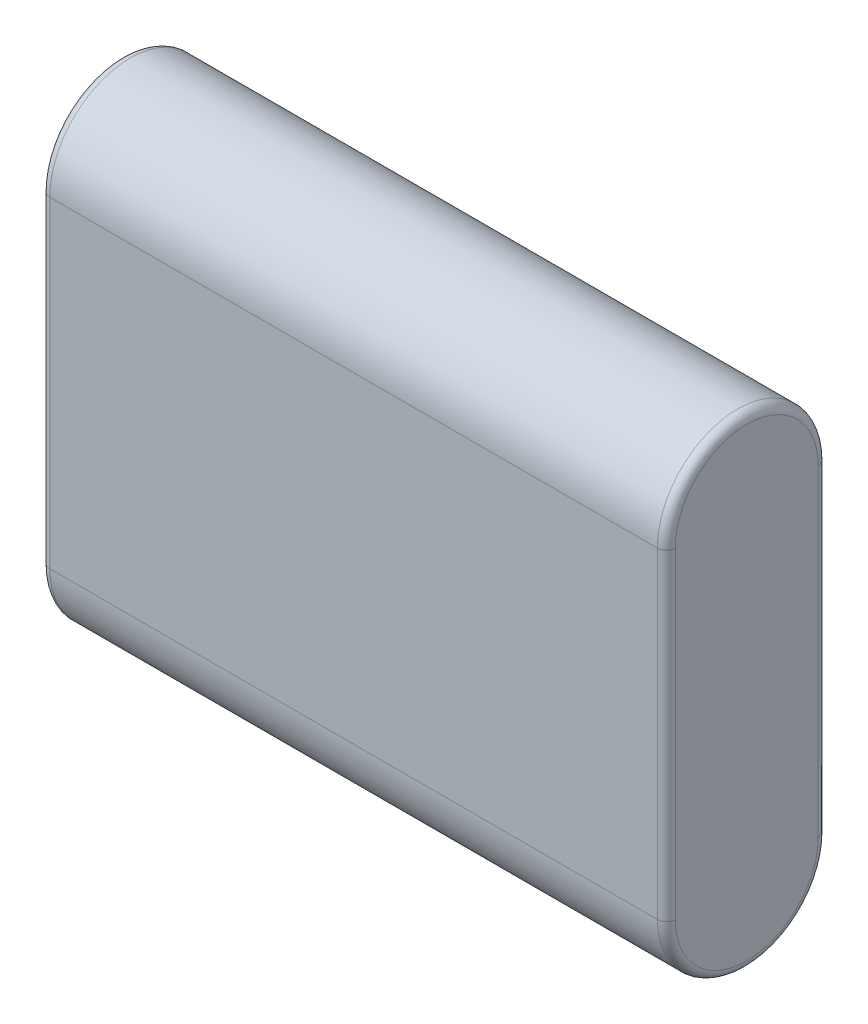
ISO-10303-21;
HEADER;
FILE_DESCRIPTION(('STEP AP214'),'2;1');
FILE_NAME('part.step','',(''),(''),'','','');
FILE_SCHEMA(('AUTOMOTIVE_DESIGN { 1 0 10303 214 1 1 1 1 }'));
ENDSEC;
DATA;
#1=APPLICATION_CONTEXT('core data for automotive mechanical design processes');
#2=APPLICATION_PROTOCOL_DEFINITION('international standard','automotive_design',2000,#1);
#3=PRODUCT_CONTEXT('',#1,'mechanical');
#4=PRODUCT('Part','Part','',(#3));
#5=PRODUCT_RELATED_PRODUCT_CATEGORY('part','',(#4));
#6=PRODUCT_DEFINITION_FORMATION('','',#4);
#7=PRODUCT_DEFINITION_CONTEXT('part definition',#1,'design');
#8=PRODUCT_DEFINITION('design','',#6,#7);
#9=PRODUCT_DEFINITION_SHAPE('','',#8);
#10=(LENGTH_UNIT() NAMED_UNIT(*) SI_UNIT(.MILLI.,.METRE.));
#11=(NAMED_UNIT(*) PLANE_ANGLE_UNIT() SI_UNIT($,.RADIAN.));
#12=(NAMED_UNIT(*) SI_UNIT($,.STERADIAN.) SOLID_ANGLE_UNIT());
#13=UNCERTAINTY_MEASURE_WITH_UNIT(LENGTH_MEASURE(1.E-05),#10,'distance_accuracy_value','');
#14=(GEOMETRIC_REPRESENTATION_CONTEXT(3) GLOBAL_UNCERTAINTY_ASSIGNED_CONTEXT((#13)) GLOBAL_UNIT_ASSIGNED_CONTEXT((#10,
#11,#12)) REPRESENTATION_CONTEXT('',''));
#15=CARTESIAN_POINT('',(0.,0.,0.));
#16=DIRECTION('',(0.,0.,1.));
#17=DIRECTION('',(1.,0.,0.));
#18=AXIS2_PLACEMENT_3D('',#15,#16,#17);
#19=CARTESIAN_POINT('',(35.,27.,18.));
#20=DIRECTION('',(0.,0.,1.));
#21=DIRECTION('',(1.,0.,0.));
#22=AXIS2_PLACEMENT_3D('',#19,#20,#21);
#23=PLANE('',#22);
#24=DIRECTION('',(0.,-1.,0.));
#25=VECTOR('',#24,1.);
#26=CARTESIAN_POINT('',(69.,13.5,18.));
#27=LINE('',#26,#25);
#28=CARTESIAN_POINT('',(69.,45.,18.));
#29=VERTEX_POINT('',#28);
#30=CARTESIAN_POINT('',(69.,9.,18.));
#31=VERTEX_POINT('',#30);
#32=EDGE_CURVE('E177',#29,#31,#27,.T.);
#33=ORIENTED_EDGE('',*,*,#32,.F.);
#34=DIRECTION('',(1.,0.,0.));
#35=VECTOR('',#34,1.);
#36=CARTESIAN_POINT('',(52.5,45.,18.));
#37=LINE('',#36,#35);
#38=CARTESIAN_POINT('',(1.,45.,18.));
#39=VERTEX_POINT('',#38);
#40=EDGE_CURVE('E126',#39,#29,#37,.T.);
#41=ORIENTED_EDGE('',*,*,#40,.F.);
#42=DIRECTION('',(0.,1.,0.));
#43=VECTOR('',#42,1.);
#44=CARTESIAN_POINT('',(1.,40.5,18.));
#45=LINE('',#44,#43);
#46=CARTESIAN_POINT('',(1.,9.,18.));
#47=VERTEX_POINT('',#46);
#48=EDGE_CURVE('E171',#47,#39,#45,.T.);
#49=ORIENTED_EDGE('',*,*,#48,.F.);
#50=DIRECTION('',(-1.,0.,0.));
#51=VECTOR('',#50,1.);
#52=CARTESIAN_POINT('',(17.5,9.,18.));
#53=LINE('',#52,#51);
#54=EDGE_CURVE('E10',#31,#47,#53,.T.);
#55=ORIENTED_EDGE('',*,*,#54,.F.);
#56=EDGE_LOOP('',(#33,#41,#49,#55));
#57=FACE_BOUND('',#56,.T.);
#58=ADVANCED_FACE('F16',(#57),#23,.T.);
#59=CARTESIAN_POINT('',(0.,54.,0.));
#60=DIRECTION('',(-1.,0.,0.));
#61=DIRECTION('',(0.,0.,1.));
#62=AXIS2_PLACEMENT_3D('',#59,#60,#61);
#63=PLANE('',#62);
#64=DIRECTION('',(0.,1.,0.));
#65=VECTOR('',#64,1.);
#66=CARTESIAN_POINT('',(0.,40.5,1.));
#67=LINE('',#66,#65);
#68=CARTESIAN_POINT('',(0.,9.,1.));
#69=VERTEX_POINT('',#68);
#70=CARTESIAN_POINT('',(0.,45.,1.));
#71=VERTEX_POINT('',#70);
#72=EDGE_CURVE('E103',#69,#71,#67,.T.);
#73=ORIENTED_EDGE('',*,*,#72,.F.);
#74=CARTESIAN_POINT('',(0.,9.,9.));
#75=DIRECTION('',(1.,0.,0.));
#76=DIRECTION('',(0.,-1.,0.));
#77=AXIS2_PLACEMENT_3D('',#74,#75,#76);
#78=CIRCLE('',#77,8.);
#79=CARTESIAN_POINT('',(0.,9.,17.));
#80=VERTEX_POINT('',#79);
#81=EDGE_CURVE('E163',#80,#69,#78,.T.);
#82=ORIENTED_EDGE('',*,*,#81,.F.);
#83=DIRECTION('',(0.,-1.,0.));
#84=VECTOR('',#83,1.);
#85=CARTESIAN_POINT('',(0.,40.5,17.));
#86=LINE('',#85,#84);
#87=CARTESIAN_POINT('',(0.,45.,17.));
#88=VERTEX_POINT('',#87);
#89=EDGE_CURVE('E168',#88,#80,#86,.T.);
#90=ORIENTED_EDGE('',*,*,#89,.F.);
#91=CARTESIAN_POINT('',(0.,45.,9.));
#92=DIRECTION('',(1.,0.,0.));
#93=DIRECTION('',(0.,1.,0.));
#94=AXIS2_PLACEMENT_3D('',#91,#92,#93);
#95=CIRCLE('',#94,8.);
#96=EDGE_CURVE('E27',#71,#88,#95,.T.);
#97=ORIENTED_EDGE('',*,*,#96,.F.);
#98=EDGE_LOOP('',(#73,#82,#90,#97));
#99=FACE_BOUND('',#98,.T.);
#100=ADVANCED_FACE('F243',(#99),#63,.T.);
#101=CARTESIAN_POINT('',(17.5,9.,9.));
#102=DIRECTION('',(1.,0.,0.));
#103=DIRECTION('',(0.,-0.707106781186547,0.707106781186548));
#104=AXIS2_PLACEMENT_3D('',#101,#102,#103);
#105=CYLINDRICAL_SURFACE('',#104,9.);
#106=CARTESIAN_POINT('',(69.,9.,9.));
#107=DIRECTION('',(1.,0.,0.));
#108=DIRECTION('',(0.,-1.,0.));
#109=AXIS2_PLACEMENT_3D('',#106,#107,#108);
#110=CIRCLE('',#109,9.);
#111=CARTESIAN_POINT('',(69.,9.,0.));
#112=VERTEX_POINT('',#111);
#113=EDGE_CURVE('E139',#31,#112,#110,.T.);
#114=ORIENTED_EDGE('',*,*,#113,.F.);
#115=ORIENTED_EDGE('',*,*,#54,.T.);
#116=CARTESIAN_POINT('',(1.,9.,9.));
#117=DIRECTION('',(-1.,0.,0.));
#118=DIRECTION('',(0.,-1.,0.));
#119=AXIS2_PLACEMENT_3D('',#116,#117,#118);
#120=CIRCLE('',#119,9.);
#121=CARTESIAN_POINT('',(1.,9.,0.));
#122=VERTEX_POINT('',#121);
#123=EDGE_CURVE('E166',#122,#47,#120,.T.);
#124=ORIENTED_EDGE('',*,*,#123,.F.);
#125=DIRECTION('',(1.,0.,0.));
#126=VECTOR('',#125,1.);
#127=CARTESIAN_POINT('',(17.5,9.,0.));
#128=LINE('',#127,#126);
#129=EDGE_CURVE('E115',#122,#112,#128,.T.);
#130=ORIENTED_EDGE('',*,*,#129,.T.);
#131=EDGE_LOOP('',(#114,#115,#124,#130));
#132=FACE_BOUND('',#131,.T.);
#133=ADVANCED_FACE('F18',(#132),#105,.T.);
#134=CARTESIAN_POINT('',(1.,45.,9.));
#135=DIRECTION('',(1.,0.,0.));
#136=DIRECTION('',(0.,0.,-1.));
#137=AXIS2_PLACEMENT_3D('',#134,#135,#136);
#138=TOROIDAL_SURFACE('',#137,8.,1.);
#139=CARTESIAN_POINT('',(1.,45.,17.));
#140=DIRECTION('',(0.,-1.,0.));
#141=DIRECTION('',(0.,0.,1.));
#142=AXIS2_PLACEMENT_3D('',#139,#140,#141);
#143=CIRCLE('',#142,1.);
#144=EDGE_CURVE('E122',#39,#88,#143,.T.);
#145=ORIENTED_EDGE('',*,*,#144,.F.);
#146=CARTESIAN_POINT('',(1.,45.,9.));
#147=DIRECTION('',(-1.,0.,0.));
#148=DIRECTION('',(0.,1.,0.));
#149=AXIS2_PLACEMENT_3D('',#146,#147,#148);
#150=CIRCLE('',#149,9.);
#151=CARTESIAN_POINT('',(1.,45.,0.));
#152=VERTEX_POINT('',#151);
#153=EDGE_CURVE('E119',#39,#152,#150,.T.);
#154=ORIENTED_EDGE('',*,*,#153,.T.);
#155=CARTESIAN_POINT('',(1.,45.,1.));
#156=DIRECTION('',(0.,-1.,0.));
#157=DIRECTION('',(-1.,0.,0.));
#158=AXIS2_PLACEMENT_3D('',#155,#156,#157);
#159=CIRCLE('',#158,1.);
#160=EDGE_CURVE('E96',#71,#152,#159,.T.);
#161=ORIENTED_EDGE('',*,*,#160,.F.);
#162=ORIENTED_EDGE('',*,*,#96,.T.);
#163=EDGE_LOOP('',(#145,#154,#161,#162));
#164=FACE_BOUND('',#163,.T.);
#165=ADVANCED_FACE('F120',(#164),#138,.T.);
#166=CARTESIAN_POINT('',(1.,40.5,17.));
#167=DIRECTION('',(0.,-1.,0.));
#168=DIRECTION('',(-0.707106781186548,0.,0.707106781186548));
#169=AXIS2_PLACEMENT_3D('',#166,#167,#168);
#170=CYLINDRICAL_SURFACE('',#169,1.);
#171=ORIENTED_EDGE('',*,*,#144,.T.);
#172=ORIENTED_EDGE('',*,*,#89,.T.);
#173=CARTESIAN_POINT('',(1.,9.,17.));
#174=DIRECTION('',(0.,-1.,0.));
#175=DIRECTION('',(0.,0.,1.));
#176=AXIS2_PLACEMENT_3D('',#173,#174,#175);
#177=CIRCLE('',#176,1.);
#178=EDGE_CURVE('E167',#47,#80,#177,.T.);
#179=ORIENTED_EDGE('',*,*,#178,.F.);
#180=ORIENTED_EDGE('',*,*,#48,.T.);
#181=EDGE_LOOP('',(#171,#172,#179,#180));
#182=FACE_BOUND('',#181,.T.);
#183=ADVANCED_FACE('F256',(#182),#170,.T.);
#184=CARTESIAN_POINT('',(1.,9.,9.));
#185=DIRECTION('',(1.,0.,0.));
#186=DIRECTION('',(0.,0.,-1.));
#187=AXIS2_PLACEMENT_3D('',#184,#185,#186);
#188=TOROIDAL_SURFACE('',#187,8.,1.);
#189=ORIENTED_EDGE('',*,*,#178,.T.);
#190=ORIENTED_EDGE('',*,*,#81,.T.);
#191=CARTESIAN_POINT('',(1.,9.,1.));
#192=DIRECTION('',(0.,1.,0.));
#193=DIRECTION('',(0.,0.,-1.));
#194=AXIS2_PLACEMENT_3D('',#191,#192,#193);
#195=CIRCLE('',#194,1.);
#196=EDGE_CURVE('E106',#122,#69,#195,.T.);
#197=ORIENTED_EDGE('',*,*,#196,.F.);
#198=ORIENTED_EDGE('',*,*,#123,.T.);
#199=EDGE_LOOP('',(#189,#190,#197,#198));
#200=FACE_BOUND('',#199,.T.);
#201=ADVANCED_FACE('F251',(#200),#188,.T.);
#202=CARTESIAN_POINT('',(1.,40.5,1.));
#203=DIRECTION('',(0.,-1.,0.));
#204=DIRECTION('',(-0.707106781186548,0.,-0.707106781186547));
#205=AXIS2_PLACEMENT_3D('',#202,#203,#204);
#206=CYLINDRICAL_SURFACE('',#205,1.);
#207=ORIENTED_EDGE('',*,*,#160,.T.);
#208=DIRECTION('',(0.,-1.,0.));
#209=VECTOR('',#208,1.);
#210=CARTESIAN_POINT('',(1.,40.5,0.));
#211=LINE('',#210,#209);
#212=EDGE_CURVE('E100',#152,#122,#211,.T.);
#213=ORIENTED_EDGE('',*,*,#212,.T.);
#214=ORIENTED_EDGE('',*,*,#196,.T.);
#215=ORIENTED_EDGE('',*,*,#72,.T.);
#216=EDGE_LOOP('',(#207,#213,#214,#215));
#217=FACE_BOUND('',#216,.T.);
#218=ADVANCED_FACE('F98',(#217),#206,.T.);
#219=CARTESIAN_POINT('',(70.,0.,0.));
#220=DIRECTION('',(1.,0.,0.));
#221=DIRECTION('',(0.,1.,0.));
#222=AXIS2_PLACEMENT_3D('',#219,#220,#221);
#223=PLANE('',#222);
#224=DIRECTION('',(0.,-1.,0.));
#225=VECTOR('',#224,1.);
#226=CARTESIAN_POINT('',(70.,13.5,1.));
#227=LINE('',#226,#225);
#228=CARTESIAN_POINT('',(70.,45.,1.));
#229=VERTEX_POINT('',#228);
#230=CARTESIAN_POINT('',(70.,9.,1.));
#231=VERTEX_POINT('',#230);
#232=EDGE_CURVE('E146',#229,#231,#227,.T.);
#233=ORIENTED_EDGE('',*,*,#232,.F.);
#234=CARTESIAN_POINT('',(70.,45.,9.));
#235=DIRECTION('',(-1.,0.,0.));
#236=DIRECTION('',(0.,1.,0.));
#237=AXIS2_PLACEMENT_3D('',#234,#235,#236);
#238=CIRCLE('',#237,8.);
#239=CARTESIAN_POINT('',(70.,45.,17.));
#240=VERTEX_POINT('',#239);
#241=EDGE_CURVE('E159',#240,#229,#238,.T.);
#242=ORIENTED_EDGE('',*,*,#241,.F.);
#243=DIRECTION('',(0.,1.,0.));
#244=VECTOR('',#243,1.);
#245=CARTESIAN_POINT('',(70.,13.5,17.));
#246=LINE('',#245,#244);
#247=CARTESIAN_POINT('',(70.,9.,17.));
#248=VERTEX_POINT('',#247);
#249=EDGE_CURVE('E20',#248,#240,#246,.T.);
#250=ORIENTED_EDGE('',*,*,#249,.F.);
#251=CARTESIAN_POINT('',(70.,9.,9.));
#252=DIRECTION('',(-1.,0.,0.));
#253=DIRECTION('',(0.,-1.,0.));
#254=AXIS2_PLACEMENT_3D('',#251,#252,#253);
#255=CIRCLE('',#254,8.);
#256=EDGE_CURVE('E133',#231,#248,#255,.T.);
#257=ORIENTED_EDGE('',*,*,#256,.F.);
#258=EDGE_LOOP('',(#233,#242,#250,#257));
#259=FACE_BOUND('',#258,.T.);
#260=ADVANCED_FACE('F227',(#259),#223,.T.);
#261=CARTESIAN_POINT('',(35.,27.,0.));
#262=DIRECTION('',(0.,0.,1.));
#263=DIRECTION('',(1.,0.,0.));
#264=AXIS2_PLACEMENT_3D('',#261,#262,#263);
#265=PLANE('',#264);
#266=DIRECTION('',(0.,1.,0.));
#267=VECTOR('',#266,1.);
#268=CARTESIAN_POINT('',(69.,13.5,0.));
#269=LINE('',#268,#267);
#270=CARTESIAN_POINT('',(69.,45.,0.));
#271=VERTEX_POINT('',#270);
#272=EDGE_CURVE('E155',#112,#271,#269,.T.);
#273=ORIENTED_EDGE('',*,*,#272,.F.);
#274=ORIENTED_EDGE('',*,*,#129,.F.);
#275=ORIENTED_EDGE('',*,*,#212,.F.);
#276=DIRECTION('',(-1.,0.,0.));
#277=VECTOR('',#276,1.);
#278=CARTESIAN_POINT('',(52.5,45.,0.));
#279=LINE('',#278,#277);
#280=EDGE_CURVE('E112',#271,#152,#279,.T.);
#281=ORIENTED_EDGE('',*,*,#280,.F.);
#282=EDGE_LOOP('',(#273,#274,#275,#281));
#283=FACE_BOUND('',#282,.T.);
#284=ADVANCED_FACE('F110',(#283),#265,.F.);
#285=CARTESIAN_POINT('',(52.5,45.,9.));
#286=DIRECTION('',(-1.,0.,0.));
#287=DIRECTION('',(0.,0.707106781186548,0.707106781186547));
#288=AXIS2_PLACEMENT_3D('',#285,#286,#287);
#289=CYLINDRICAL_SURFACE('',#288,9.);
#290=CARTESIAN_POINT('',(69.,45.,9.));
#291=DIRECTION('',(1.,0.,0.));
#292=DIRECTION('',(0.,1.,0.));
#293=AXIS2_PLACEMENT_3D('',#290,#291,#292);
#294=CIRCLE('',#293,9.);
#295=EDGE_CURVE('E130',#271,#29,#294,.T.);
#296=ORIENTED_EDGE('',*,*,#295,.F.);
#297=ORIENTED_EDGE('',*,*,#280,.T.);
#298=ORIENTED_EDGE('',*,*,#153,.F.);
#299=ORIENTED_EDGE('',*,*,#40,.T.);
#300=EDGE_LOOP('',(#296,#297,#298,#299));
#301=FACE_BOUND('',#300,.T.);
#302=ADVANCED_FACE('F128',(#301),#289,.T.);
#303=CARTESIAN_POINT('',(69.,9.,9.));
#304=DIRECTION('',(-1.,0.,0.));
#305=DIRECTION('',(0.,0.,1.));
#306=AXIS2_PLACEMENT_3D('',#303,#304,#305);
#307=TOROIDAL_SURFACE('',#306,8.,1.);
#308=CARTESIAN_POINT('',(69.,9.,17.));
#309=DIRECTION('',(0.,1.,0.));
#310=DIRECTION('',(0.,0.,1.));
#311=AXIS2_PLACEMENT_3D('',#308,#309,#310);
#312=CIRCLE('',#311,1.);
#313=EDGE_CURVE('E193',#31,#248,#312,.T.);
#314=ORIENTED_EDGE('',*,*,#313,.F.);
#315=ORIENTED_EDGE('',*,*,#113,.T.);
#316=CARTESIAN_POINT('',(69.,9.,1.));
#317=DIRECTION('',(0.,1.,0.));
#318=DIRECTION('',(1.,0.,0.));
#319=AXIS2_PLACEMENT_3D('',#316,#317,#318);
#320=CIRCLE('',#319,1.);
#321=EDGE_CURVE('E143',#231,#112,#320,.T.);
#322=ORIENTED_EDGE('',*,*,#321,.F.);
#323=ORIENTED_EDGE('',*,*,#256,.T.);
#324=EDGE_LOOP('',(#314,#315,#322,#323));
#325=FACE_BOUND('',#324,.T.);
#326=ADVANCED_FACE('F219',(#325),#307,.T.);
#327=CARTESIAN_POINT('',(69.,13.5,17.));
#328=DIRECTION('',(0.,1.,0.));
#329=DIRECTION('',(0.707106781186546,0.,0.707106781186549));
#330=AXIS2_PLACEMENT_3D('',#327,#328,#329);
#331=CYLINDRICAL_SURFACE('',#330,1.);
#332=ORIENTED_EDGE('',*,*,#313,.T.);
#333=ORIENTED_EDGE('',*,*,#249,.T.);
#334=CARTESIAN_POINT('',(69.,45.,17.));
#335=DIRECTION('',(0.,1.,0.));
#336=DIRECTION('',(0.,0.,1.));
#337=AXIS2_PLACEMENT_3D('',#334,#335,#336);
#338=CIRCLE('',#337,1.);
#339=EDGE_CURVE('E150',#29,#240,#338,.T.);
#340=ORIENTED_EDGE('',*,*,#339,.F.);
#341=ORIENTED_EDGE('',*,*,#32,.T.);
#342=EDGE_LOOP('',(#332,#333,#340,#341));
#343=FACE_BOUND('',#342,.T.);
#344=ADVANCED_FACE('F215',(#343),#331,.T.);
#345=CARTESIAN_POINT('',(69.,45.,9.));
#346=DIRECTION('',(-1.,0.,0.));
#347=DIRECTION('',(0.,0.,1.));
#348=AXIS2_PLACEMENT_3D('',#345,#346,#347);
#349=TOROIDAL_SURFACE('',#348,8.,1.);
#350=ORIENTED_EDGE('',*,*,#339,.T.);
#351=ORIENTED_EDGE('',*,*,#241,.T.);
#352=CARTESIAN_POINT('',(69.,45.,1.));
#353=DIRECTION('',(0.,-1.,0.));
#354=DIRECTION('',(0.,0.,-1.));
#355=AXIS2_PLACEMENT_3D('',#352,#353,#354);
#356=CIRCLE('',#355,1.);
#357=EDGE_CURVE('E151',#271,#229,#356,.T.);
#358=ORIENTED_EDGE('',*,*,#357,.F.);
#359=ORIENTED_EDGE('',*,*,#295,.T.);
#360=EDGE_LOOP('',(#350,#351,#358,#359));
#361=FACE_BOUND('',#360,.T.);
#362=ADVANCED_FACE('F228',(#361),#349,.T.);
#363=CARTESIAN_POINT('',(69.,13.5,1.));
#364=DIRECTION('',(0.,1.,0.));
#365=DIRECTION('',(0.707106781186546,0.,-0.707106781186549));
#366=AXIS2_PLACEMENT_3D('',#363,#364,#365);
#367=CYLINDRICAL_SURFACE('',#366,1.);
#368=ORIENTED_EDGE('',*,*,#321,.T.);
#369=ORIENTED_EDGE('',*,*,#272,.T.);
#370=ORIENTED_EDGE('',*,*,#357,.T.);
#371=ORIENTED_EDGE('',*,*,#232,.T.);
#372=EDGE_LOOP('',(#368,#369,#370,#371));
#373=FACE_BOUND('',#372,.T.);
#374=ADVANCED_FACE('F230',(#373),#367,.T.);
#375=CLOSED_SHELL('',(#58,#100,#133,#165,#183,#201,#218,#260,#284,#302,#326,#344,#362,#374));
#376=MANIFOLD_SOLID_BREP('B1',#375);
#377=ADVANCED_BREP_SHAPE_REPRESENTATION('',(#18,#376),#14);
#378=SHAPE_DEFINITION_REPRESENTATION(#9,#377);
ENDSEC;
END-ISO-10303-21;
